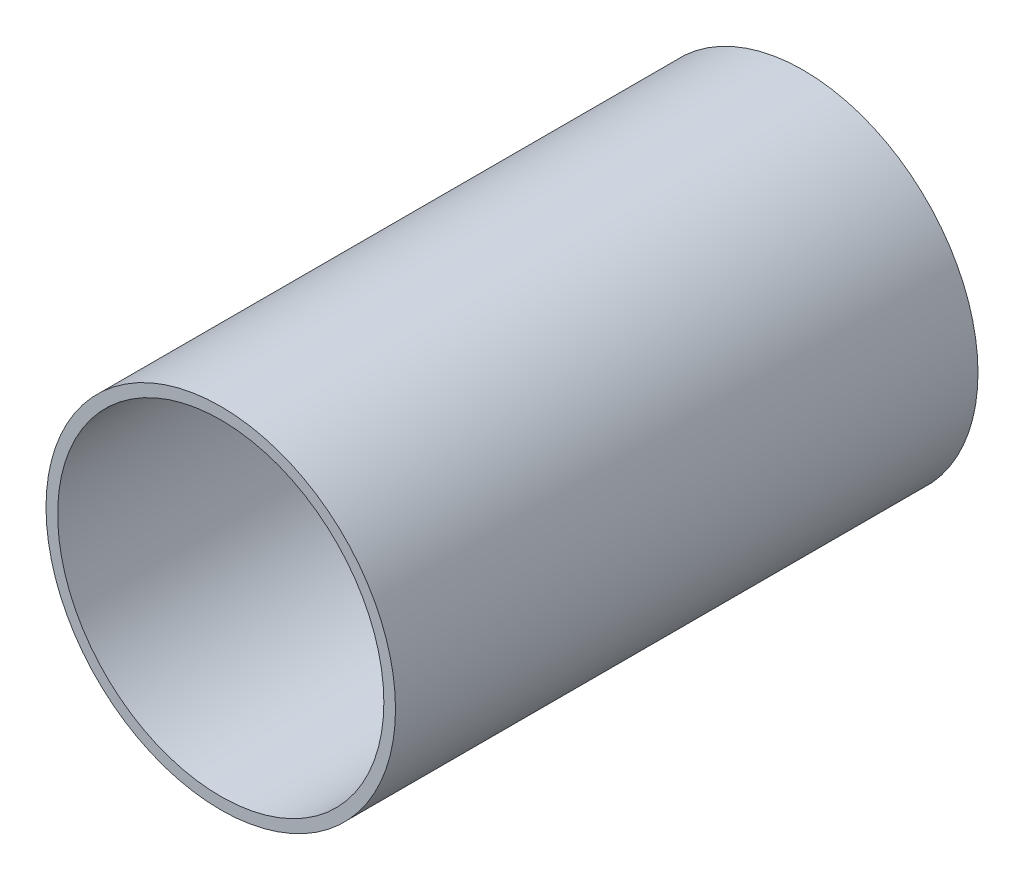
ISO-10303-21;
HEADER;
FILE_DESCRIPTION(('STEP AP214'),'2;1');
FILE_NAME('part.step','',(''),(''),'','','');
FILE_SCHEMA(('AUTOMOTIVE_DESIGN { 1 0 10303 214 1 1 1 1 }'));
ENDSEC;
DATA;
#1=APPLICATION_CONTEXT('core data for automotive mechanical design processes');
#2=APPLICATION_PROTOCOL_DEFINITION('international standard','automotive_design',2000,#1);
#3=PRODUCT_CONTEXT('',#1,'mechanical');
#4=PRODUCT('Part','Part','',(#3));
#5=PRODUCT_RELATED_PRODUCT_CATEGORY('part','',(#4));
#6=PRODUCT_DEFINITION_FORMATION('','',#4);
#7=PRODUCT_DEFINITION_CONTEXT('part definition',#1,'design');
#8=PRODUCT_DEFINITION('design','',#6,#7);
#9=PRODUCT_DEFINITION_SHAPE('','',#8);
#10=(LENGTH_UNIT() NAMED_UNIT(*) SI_UNIT(.MILLI.,.METRE.));
#11=(NAMED_UNIT(*) PLANE_ANGLE_UNIT() SI_UNIT($,.RADIAN.));
#12=(NAMED_UNIT(*) SI_UNIT($,.STERADIAN.) SOLID_ANGLE_UNIT());
#13=UNCERTAINTY_MEASURE_WITH_UNIT(LENGTH_MEASURE(1.E-05),#10,'distance_accuracy_value','');
#14=(GEOMETRIC_REPRESENTATION_CONTEXT(3) GLOBAL_UNCERTAINTY_ASSIGNED_CONTEXT((#13)) GLOBAL_UNIT_ASSIGNED_CONTEXT((#10,
#11,#12)) REPRESENTATION_CONTEXT('',''));
#15=CARTESIAN_POINT('',(0.,0.,0.));
#16=DIRECTION('',(0.,0.,1.));
#17=DIRECTION('',(1.,0.,0.));
#18=AXIS2_PLACEMENT_3D('',#15,#16,#17);
#19=CARTESIAN_POINT('',(0.,0.,150.));
#20=DIRECTION('',(0.,0.,1.));
#21=DIRECTION('',(1.,0.,0.));
#22=AXIS2_PLACEMENT_3D('',#19,#20,#21);
#23=PLANE('',#22);
#24=CARTESIAN_POINT('',(0.,0.,150.));
#25=DIRECTION('',(0.,0.,1.));
#26=DIRECTION('',(1.,0.,0.));
#27=AXIS2_PLACEMENT_3D('',#24,#25,#26);
#28=CIRCLE('',#27,45.);
#29=CARTESIAN_POINT('',(45.,0.,150.));
#30=VERTEX_POINT('',#29);
#31=EDGE_CURVE('E10',#30,#30,#28,.T.);
#32=ORIENTED_EDGE('',*,*,#31,.T.);
#33=EDGE_LOOP('',(#32));
#34=FACE_BOUND('',#33,.T.);
#35=CARTESIAN_POINT('',(0.,0.,150.));
#36=DIRECTION('',(0.,0.,1.));
#37=DIRECTION('',(1.,0.,0.));
#38=AXIS2_PLACEMENT_3D('',#35,#36,#37);
#39=CIRCLE('',#38,42.);
#40=CARTESIAN_POINT('',(42.,0.,150.));
#41=VERTEX_POINT('',#40);
#42=EDGE_CURVE('E46',#41,#41,#39,.T.);
#43=ORIENTED_EDGE('',*,*,#42,.F.);
#44=EDGE_LOOP('',(#43));
#45=FACE_BOUND('',#44,.T.);
#46=ADVANCED_FACE('F35',(#34,#45),#23,.T.);
#47=CARTESIAN_POINT('',(0.,0.,0.));
#48=DIRECTION('',(0.,0.,1.));
#49=DIRECTION('',(1.,0.,0.));
#50=AXIS2_PLACEMENT_3D('',#47,#48,#49);
#51=PLANE('',#50);
#52=CARTESIAN_POINT('',(0.,0.,0.));
#53=DIRECTION('',(0.,0.,1.));
#54=DIRECTION('',(1.,0.,0.));
#55=AXIS2_PLACEMENT_3D('',#52,#53,#54);
#56=CIRCLE('',#55,45.);
#57=CARTESIAN_POINT('',(45.,0.,0.));
#58=VERTEX_POINT('',#57);
#59=EDGE_CURVE('E39',#58,#58,#56,.T.);
#60=ORIENTED_EDGE('',*,*,#59,.F.);
#61=EDGE_LOOP('',(#60));
#62=FACE_BOUND('',#61,.T.);
#63=CARTESIAN_POINT('',(0.,0.,0.));
#64=DIRECTION('',(0.,0.,1.));
#65=DIRECTION('',(1.,0.,0.));
#66=AXIS2_PLACEMENT_3D('',#63,#64,#65);
#67=CIRCLE('',#66,42.);
#68=CARTESIAN_POINT('',(42.,0.,0.));
#69=VERTEX_POINT('',#68);
#70=EDGE_CURVE('E48',#69,#69,#67,.T.);
#71=ORIENTED_EDGE('',*,*,#70,.T.);
#72=EDGE_LOOP('',(#71));
#73=FACE_BOUND('',#72,.T.);
#74=ADVANCED_FACE('F58',(#62,#73),#51,.F.);
#75=CARTESIAN_POINT('',(0.,0.,150.));
#76=DIRECTION('',(0.,0.,-1.));
#77=DIRECTION('',(-1.,0.,0.));
#78=AXIS2_PLACEMENT_3D('',#75,#76,#77);
#79=CYLINDRICAL_SURFACE('',#78,45.);
#80=ORIENTED_EDGE('',*,*,#31,.F.);
#81=EDGE_LOOP('',(#80));
#82=FACE_BOUND('',#81,.T.);
#83=ORIENTED_EDGE('',*,*,#59,.T.);
#84=EDGE_LOOP('',(#83));
#85=FACE_BOUND('',#84,.T.);
#86=ADVANCED_FACE('F37',(#82,#85),#79,.T.);
#87=CARTESIAN_POINT('',(0.,0.,150.));
#88=DIRECTION('',(0.,0.,-1.));
#89=DIRECTION('',(-1.,0.,0.));
#90=AXIS2_PLACEMENT_3D('',#87,#88,#89);
#91=CYLINDRICAL_SURFACE('',#90,42.);
#92=ORIENTED_EDGE('',*,*,#42,.T.);
#93=EDGE_LOOP('',(#92));
#94=FACE_BOUND('',#93,.T.);
#95=ORIENTED_EDGE('',*,*,#70,.F.);
#96=EDGE_LOOP('',(#95));
#97=FACE_BOUND('',#96,.T.);
#98=ADVANCED_FACE('F54',(#94,#97),#91,.F.);
#99=CLOSED_SHELL('',(#46,#74,#86,#98));
#100=MANIFOLD_SOLID_BREP('B2',#99);
#101=ADVANCED_BREP_SHAPE_REPRESENTATION('',(#18,#100),#14);
#102=SHAPE_DEFINITION_REPRESENTATION(#9,#101);
ENDSEC;
END-ISO-10303-21;
